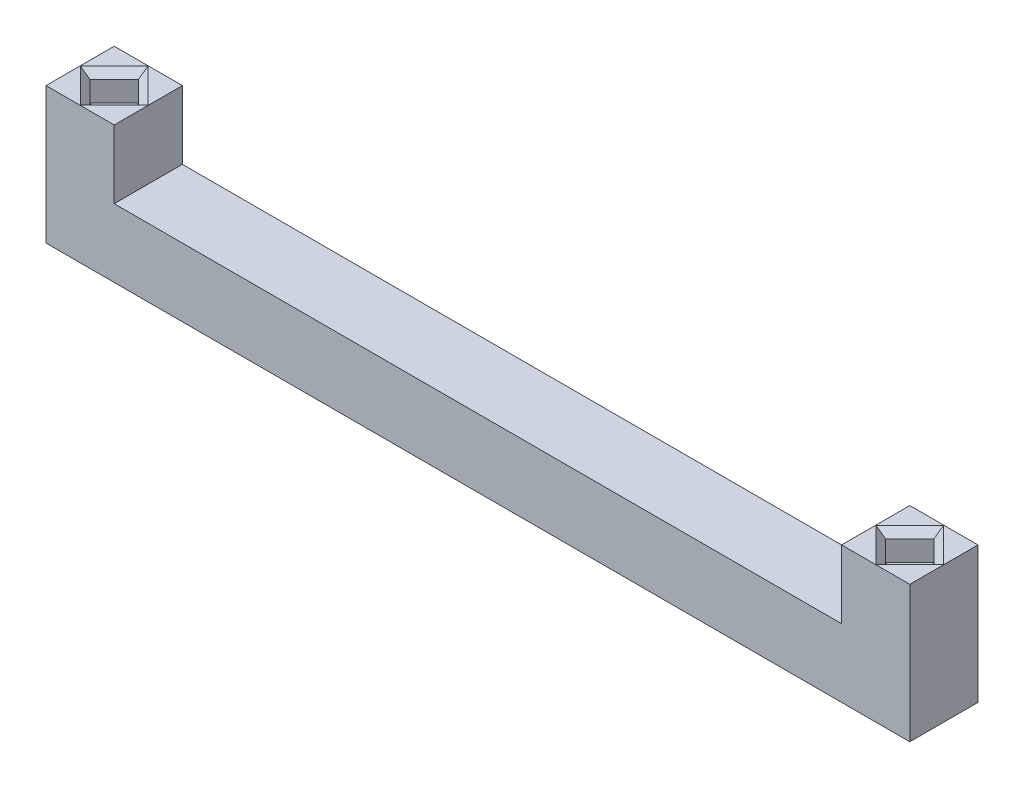
ISO-10303-21;
HEADER;
FILE_DESCRIPTION(('STEP AP214'),'2;1');
FILE_NAME('part.step','',(''),(''),'','','');
FILE_SCHEMA(('AUTOMOTIVE_DESIGN { 1 0 10303 214 1 1 1 1 }'));
ENDSEC;
DATA;
#1=APPLICATION_CONTEXT('core data for automotive mechanical design processes');
#2=APPLICATION_PROTOCOL_DEFINITION('international standard','automotive_design',2000,#1);
#3=PRODUCT_CONTEXT('',#1,'mechanical');
#4=PRODUCT('Part','Part','',(#3));
#5=PRODUCT_RELATED_PRODUCT_CATEGORY('part','',(#4));
#6=PRODUCT_DEFINITION_FORMATION('','',#4);
#7=PRODUCT_DEFINITION_CONTEXT('part definition',#1,'design');
#8=PRODUCT_DEFINITION('design','',#6,#7);
#9=PRODUCT_DEFINITION_SHAPE('','',#8);
#10=(LENGTH_UNIT() NAMED_UNIT(*) SI_UNIT(.MILLI.,.METRE.));
#11=(NAMED_UNIT(*) PLANE_ANGLE_UNIT() SI_UNIT($,.RADIAN.));
#12=(NAMED_UNIT(*) SI_UNIT($,.STERADIAN.) SOLID_ANGLE_UNIT());
#13=UNCERTAINTY_MEASURE_WITH_UNIT(LENGTH_MEASURE(1.E-05),#10,'distance_accuracy_value','');
#14=(GEOMETRIC_REPRESENTATION_CONTEXT(3) GLOBAL_UNCERTAINTY_ASSIGNED_CONTEXT((#13)) GLOBAL_UNIT_ASSIGNED_CONTEXT((#10,
#11,#12)) REPRESENTATION_CONTEXT('',''));
#15=CARTESIAN_POINT('',(0.,0.,0.));
#16=DIRECTION('',(0.,0.,1.));
#17=DIRECTION('',(1.,0.,0.));
#18=AXIS2_PLACEMENT_3D('',#15,#16,#17);
#19=CARTESIAN_POINT('',(-67.7333333333333,19.05,12.7));
#20=DIRECTION('',(0.,-1.,0.));
#21=DIRECTION('',(1.,0.,0.));
#22=AXIS2_PLACEMENT_3D('',#19,#20,#21);
#23=PLANE('',#22);
#24=DIRECTION('',(0.707106781186547,0.,0.707106781186548));
#25=VECTOR('',#24,1.);
#26=CARTESIAN_POINT('',(-64.5902436909591,19.05,9.55691035762579));
#27=LINE('',#26,#25);
#28=CARTESIAN_POINT('',(-74.0833333333333,19.05,0.0638207152515661));
#29=VERTEX_POINT('',#28);
#30=CARTESIAN_POINT('',(-67.7971540485849,19.05,6.35));
#31=VERTEX_POINT('',#30);
#32=EDGE_CURVE('E292',#29,#31,#27,.T.);
#33=ORIENTED_EDGE('',*,*,#32,.T.);
#34=DIRECTION('',(-0.707106781186547,0.,0.707106781186548));
#35=VECTOR('',#34,1.);
#36=CARTESIAN_POINT('',(-70.9402436909591,19.05,9.49308964237422));
#37=LINE('',#36,#35);
#38=CARTESIAN_POINT('',(-74.0833333333333,19.05,12.6361792847484));
#39=VERTEX_POINT('',#38);
#40=EDGE_CURVE('E294',#31,#39,#37,.T.);
#41=ORIENTED_EDGE('',*,*,#40,.T.);
#42=DIRECTION('',(-0.707106781186547,0.,-0.707106781186548));
#43=VECTOR('',#42,1.);
#44=CARTESIAN_POINT('',(-70.8764229757076,19.05,15.8430896423742));
#45=LINE('',#44,#43);
#46=CARTESIAN_POINT('',(-80.3695126180818,19.05,6.35));
#47=VERTEX_POINT('',#46);
#48=EDGE_CURVE('E290',#39,#47,#45,.T.);
#49=ORIENTED_EDGE('',*,*,#48,.T.);
#50=DIRECTION('',(0.707106781186547,0.,-0.707106781186548));
#51=VECTOR('',#50,1.);
#52=CARTESIAN_POINT('',(-77.2264229757075,19.05,3.20691035762578));
#53=LINE('',#52,#51);
#54=EDGE_CURVE('E288',#47,#29,#53,.T.);
#55=ORIENTED_EDGE('',*,*,#54,.T.);
#56=EDGE_LOOP('',(#33,#41,#49,#55));
#57=FACE_BOUND('',#56,.T.);
#58=DIRECTION('',(-1.,0.,0.));
#59=VECTOR('',#58,1.);
#60=CARTESIAN_POINT('',(-67.7333333333333,19.05,0.));
#61=LINE('',#60,#59);
#62=CARTESIAN_POINT('',(-67.7333333333333,19.05,0.));
#63=VERTEX_POINT('',#62);
#64=CARTESIAN_POINT('',(-80.4333333333333,19.05,0.));
#65=VERTEX_POINT('',#64);
#66=EDGE_CURVE('E228',#63,#65,#61,.T.);
#67=ORIENTED_EDGE('',*,*,#66,.T.);
#68=DIRECTION('',(0.,0.,-1.));
#69=VECTOR('',#68,1.);
#70=CARTESIAN_POINT('',(-80.4333333333333,19.05,12.7));
#71=LINE('',#70,#69);
#72=CARTESIAN_POINT('',(-80.4333333333333,19.05,12.7));
#73=VERTEX_POINT('',#72);
#74=EDGE_CURVE('E209',#73,#65,#71,.T.);
#75=ORIENTED_EDGE('',*,*,#74,.F.);
#76=DIRECTION('',(-1.,0.,0.));
#77=VECTOR('',#76,1.);
#78=CARTESIAN_POINT('',(-67.7333333333333,19.05,12.7));
#79=LINE('',#78,#77);
#80=CARTESIAN_POINT('',(-67.7333333333333,19.05,12.7));
#81=VERTEX_POINT('',#80);
#82=EDGE_CURVE('E216',#81,#73,#79,.T.);
#83=ORIENTED_EDGE('',*,*,#82,.F.);
#84=DIRECTION('',(0.,0.,-1.));
#85=VECTOR('',#84,1.);
#86=CARTESIAN_POINT('',(-67.7333333333333,19.05,12.7));
#87=LINE('',#86,#85);
#88=EDGE_CURVE('E382',#81,#63,#87,.T.);
#89=ORIENTED_EDGE('',*,*,#88,.T.);
#90=EDGE_LOOP('',(#67,#75,#83,#89));
#91=FACE_BOUND('',#90,.T.);
#92=ADVANCED_FACE('F41',(#57,#91),#23,.F.);
#93=CARTESIAN_POINT('',(-80.4333333333333,19.05,12.7));
#94=DIRECTION('',(1.,0.,0.));
#95=DIRECTION('',(0.,0.,-1.));
#96=AXIS2_PLACEMENT_3D('',#93,#94,#95);
#97=PLANE('',#96);
#98=DIRECTION('',(0.,-1.,0.));
#99=VECTOR('',#98,1.);
#100=CARTESIAN_POINT('',(-80.4333333333333,19.05,0.));
#101=LINE('',#100,#99);
#102=CARTESIAN_POINT('',(-80.4333333333333,-6.35,0.));
#103=VERTEX_POINT('',#102);
#104=EDGE_CURVE('E384',#65,#103,#101,.T.);
#105=ORIENTED_EDGE('',*,*,#104,.T.);
#106=DIRECTION('',(0.,0.,-1.));
#107=VECTOR('',#106,1.);
#108=CARTESIAN_POINT('',(-80.4333333333333,-6.35,12.7));
#109=LINE('',#108,#107);
#110=CARTESIAN_POINT('',(-80.4333333333333,-6.35,12.7));
#111=VERTEX_POINT('',#110);
#112=EDGE_CURVE('E212',#111,#103,#109,.T.);
#113=ORIENTED_EDGE('',*,*,#112,.F.);
#114=DIRECTION('',(0.,-1.,0.));
#115=VECTOR('',#114,1.);
#116=CARTESIAN_POINT('',(-80.4333333333333,19.05,12.7));
#117=LINE('',#116,#115);
#118=EDGE_CURVE('E205',#73,#111,#117,.T.);
#119=ORIENTED_EDGE('',*,*,#118,.F.);
#120=ORIENTED_EDGE('',*,*,#74,.T.);
#121=EDGE_LOOP('',(#105,#113,#119,#120));
#122=FACE_BOUND('',#121,.T.);
#123=ADVANCED_FACE('F207',(#122),#97,.F.);
#124=CARTESIAN_POINT('',(-80.4333333333333,-6.35,12.7));
#125=DIRECTION('',(0.,1.,0.));
#126=DIRECTION('',(0.,0.,1.));
#127=AXIS2_PLACEMENT_3D('',#124,#125,#126);
#128=PLANE('',#127);
#129=DIRECTION('',(1.,0.,0.));
#130=VECTOR('',#129,1.);
#131=CARTESIAN_POINT('',(-80.4333333333333,-6.35,0.));
#132=LINE('',#131,#130);
#133=CARTESIAN_POINT('',(80.4333333333333,-6.35,0.));
#134=VERTEX_POINT('',#133);
#135=EDGE_CURVE('E387',#103,#134,#132,.T.);
#136=ORIENTED_EDGE('',*,*,#135,.T.);
#137=DIRECTION('',(0.,0.,-1.));
#138=VECTOR('',#137,1.);
#139=CARTESIAN_POINT('',(80.4333333333333,-6.35,12.7));
#140=LINE('',#139,#138);
#141=CARTESIAN_POINT('',(80.4333333333333,-6.35,12.7));
#142=VERTEX_POINT('',#141);
#143=EDGE_CURVE('E233',#142,#134,#140,.T.);
#144=ORIENTED_EDGE('',*,*,#143,.F.);
#145=DIRECTION('',(1.,0.,0.));
#146=VECTOR('',#145,1.);
#147=CARTESIAN_POINT('',(-80.4333333333333,-6.35,12.7));
#148=LINE('',#147,#146);
#149=EDGE_CURVE('E215',#111,#142,#148,.T.);
#150=ORIENTED_EDGE('',*,*,#149,.F.);
#151=ORIENTED_EDGE('',*,*,#112,.T.);
#152=EDGE_LOOP('',(#136,#144,#150,#151));
#153=FACE_BOUND('',#152,.T.);
#154=ADVANCED_FACE('F432',(#153),#128,.F.);
#155=CARTESIAN_POINT('',(80.4333333333333,-6.35,12.7));
#156=DIRECTION('',(-1.,0.,0.));
#157=DIRECTION('',(0.,0.,1.));
#158=AXIS2_PLACEMENT_3D('',#155,#156,#157);
#159=PLANE('',#158);
#160=DIRECTION('',(0.,1.,0.));
#161=VECTOR('',#160,1.);
#162=CARTESIAN_POINT('',(80.4333333333333,-6.35,0.));
#163=LINE('',#162,#161);
#164=CARTESIAN_POINT('',(80.4333333333333,19.05,0.));
#165=VERTEX_POINT('',#164);
#166=EDGE_CURVE('E389',#134,#165,#163,.T.);
#167=ORIENTED_EDGE('',*,*,#166,.T.);
#168=DIRECTION('',(0.,0.,-1.));
#169=VECTOR('',#168,1.);
#170=CARTESIAN_POINT('',(80.4333333333333,19.05,12.7));
#171=LINE('',#170,#169);
#172=CARTESIAN_POINT('',(80.4333333333333,19.05,12.7));
#173=VERTEX_POINT('',#172);
#174=EDGE_CURVE('E408',#173,#165,#171,.T.);
#175=ORIENTED_EDGE('',*,*,#174,.F.);
#176=DIRECTION('',(0.,1.,0.));
#177=VECTOR('',#176,1.);
#178=CARTESIAN_POINT('',(80.4333333333333,-6.35,12.7));
#179=LINE('',#178,#177);
#180=EDGE_CURVE('E373',#142,#173,#179,.T.);
#181=ORIENTED_EDGE('',*,*,#180,.F.);
#182=ORIENTED_EDGE('',*,*,#143,.T.);
#183=EDGE_LOOP('',(#167,#175,#181,#182));
#184=FACE_BOUND('',#183,.T.);
#185=ADVANCED_FACE('F415',(#184),#159,.F.);
#186=CARTESIAN_POINT('',(80.4333333333333,19.05,12.7));
#187=DIRECTION('',(0.,-1.,0.));
#188=DIRECTION('',(1.,0.,0.));
#189=AXIS2_PLACEMENT_3D('',#186,#187,#188);
#190=PLANE('',#189);
#191=DIRECTION('',(0.707106781186547,0.,-0.707106781186548));
#192=VECTOR('',#191,1.);
#193=CARTESIAN_POINT('',(70.9402436909591,19.05,3.20691035762581));
#194=LINE('',#193,#192);
#195=CARTESIAN_POINT('',(67.797154048585,19.05,6.35));
#196=VERTEX_POINT('',#195);
#197=CARTESIAN_POINT('',(74.0833333333333,19.05,0.0638207152516151));
#198=VERTEX_POINT('',#197);
#199=EDGE_CURVE('E297',#196,#198,#194,.T.);
#200=ORIENTED_EDGE('',*,*,#199,.T.);
#201=DIRECTION('',(0.707106781186547,0.,0.707106781186548));
#202=VECTOR('',#201,1.);
#203=CARTESIAN_POINT('',(83.5764229757075,19.05,9.55691035762581));
#204=LINE('',#203,#202);
#205=CARTESIAN_POINT('',(80.3695126180817,19.05,6.35));
#206=VERTEX_POINT('',#205);
#207=EDGE_CURVE('E11',#198,#206,#204,.T.);
#208=ORIENTED_EDGE('',*,*,#207,.T.);
#209=DIRECTION('',(-0.707106781186547,0.,0.707106781186548));
#210=VECTOR('',#209,1.);
#211=CARTESIAN_POINT('',(77.2264229757075,19.05,9.49308964237419));
#212=LINE('',#211,#210);
#213=CARTESIAN_POINT('',(74.0833333333333,19.05,12.6361792847484));
#214=VERTEX_POINT('',#213);
#215=EDGE_CURVE('E51',#206,#214,#212,.T.);
#216=ORIENTED_EDGE('',*,*,#215,.T.);
#217=DIRECTION('',(-0.707106781186547,0.,-0.707106781186548));
#218=VECTOR('',#217,1.);
#219=CARTESIAN_POINT('',(77.2902436909591,19.05,15.8430896423742));
#220=LINE('',#219,#218);
#221=EDGE_CURVE('E299',#214,#196,#220,.T.);
#222=ORIENTED_EDGE('',*,*,#221,.T.);
#223=EDGE_LOOP('',(#200,#208,#216,#222));
#224=FACE_BOUND('',#223,.T.);
#225=DIRECTION('',(-1.,0.,0.));
#226=VECTOR('',#225,1.);
#227=CARTESIAN_POINT('',(80.4333333333333,19.05,0.));
#228=LINE('',#227,#226);
#229=CARTESIAN_POINT('',(67.7333333333333,19.05,0.));
#230=VERTEX_POINT('',#229);
#231=EDGE_CURVE('E391',#165,#230,#228,.T.);
#232=ORIENTED_EDGE('',*,*,#231,.T.);
#233=DIRECTION('',(0.,0.,-1.));
#234=VECTOR('',#233,1.);
#235=CARTESIAN_POINT('',(67.7333333333333,19.05,12.7));
#236=LINE('',#235,#234);
#237=CARTESIAN_POINT('',(67.7333333333333,19.05,12.7));
#238=VERTEX_POINT('',#237);
#239=EDGE_CURVE('E405',#238,#230,#236,.T.);
#240=ORIENTED_EDGE('',*,*,#239,.F.);
#241=DIRECTION('',(-1.,0.,0.));
#242=VECTOR('',#241,1.);
#243=CARTESIAN_POINT('',(80.4333333333333,19.05,12.7));
#244=LINE('',#243,#242);
#245=EDGE_CURVE('E375',#173,#238,#244,.T.);
#246=ORIENTED_EDGE('',*,*,#245,.F.);
#247=ORIENTED_EDGE('',*,*,#174,.T.);
#248=EDGE_LOOP('',(#232,#240,#246,#247));
#249=FACE_BOUND('',#248,.T.);
#250=ADVANCED_FACE('F348',(#224,#249),#190,.F.);
#251=CARTESIAN_POINT('',(67.7333333333333,19.05,12.7));
#252=DIRECTION('',(1.,0.,0.));
#253=DIRECTION('',(0.,0.,-1.));
#254=AXIS2_PLACEMENT_3D('',#251,#252,#253);
#255=PLANE('',#254);
#256=DIRECTION('',(0.,-1.,0.));
#257=VECTOR('',#256,1.);
#258=CARTESIAN_POINT('',(67.7333333333333,19.05,0.));
#259=LINE('',#258,#257);
#260=CARTESIAN_POINT('',(67.7333333333333,6.35,0.));
#261=VERTEX_POINT('',#260);
#262=EDGE_CURVE('E393',#230,#261,#259,.T.);
#263=ORIENTED_EDGE('',*,*,#262,.T.);
#264=DIRECTION('',(0.,0.,-1.));
#265=VECTOR('',#264,1.);
#266=CARTESIAN_POINT('',(67.7333333333333,6.35,12.7));
#267=LINE('',#266,#265);
#268=CARTESIAN_POINT('',(67.7333333333333,6.35,12.7));
#269=VERTEX_POINT('',#268);
#270=EDGE_CURVE('E402',#269,#261,#267,.T.);
#271=ORIENTED_EDGE('',*,*,#270,.F.);
#272=DIRECTION('',(0.,-1.,0.));
#273=VECTOR('',#272,1.);
#274=CARTESIAN_POINT('',(67.7333333333333,19.05,12.7));
#275=LINE('',#274,#273);
#276=EDGE_CURVE('E377',#238,#269,#275,.T.);
#277=ORIENTED_EDGE('',*,*,#276,.F.);
#278=ORIENTED_EDGE('',*,*,#239,.T.);
#279=EDGE_LOOP('',(#263,#271,#277,#278));
#280=FACE_BOUND('',#279,.T.);
#281=ADVANCED_FACE('F428',(#280),#255,.F.);
#282=CARTESIAN_POINT('',(67.7333333333333,6.35,12.7));
#283=DIRECTION('',(0.,-1.,0.));
#284=DIRECTION('',(0.,0.,-1.));
#285=AXIS2_PLACEMENT_3D('',#282,#283,#284);
#286=PLANE('',#285);
#287=DIRECTION('',(-1.,0.,0.));
#288=VECTOR('',#287,1.);
#289=CARTESIAN_POINT('',(67.7333333333333,6.35,0.));
#290=LINE('',#289,#288);
#291=CARTESIAN_POINT('',(-67.7333333333333,6.35,0.));
#292=VERTEX_POINT('',#291);
#293=EDGE_CURVE('E395',#261,#292,#290,.T.);
#294=ORIENTED_EDGE('',*,*,#293,.T.);
#295=DIRECTION('',(0.,0.,-1.));
#296=VECTOR('',#295,1.);
#297=CARTESIAN_POINT('',(-67.7333333333333,6.35,12.7));
#298=LINE('',#297,#296);
#299=CARTESIAN_POINT('',(-67.7333333333333,6.35,12.7));
#300=VERTEX_POINT('',#299);
#301=EDGE_CURVE('E399',#300,#292,#298,.T.);
#302=ORIENTED_EDGE('',*,*,#301,.F.);
#303=DIRECTION('',(-1.,0.,0.));
#304=VECTOR('',#303,1.);
#305=CARTESIAN_POINT('',(67.7333333333333,6.35,12.7));
#306=LINE('',#305,#304);
#307=EDGE_CURVE('E379',#269,#300,#306,.T.);
#308=ORIENTED_EDGE('',*,*,#307,.F.);
#309=ORIENTED_EDGE('',*,*,#270,.T.);
#310=EDGE_LOOP('',(#294,#302,#308,#309));
#311=FACE_BOUND('',#310,.T.);
#312=ADVANCED_FACE('F718',(#311),#286,.F.);
#313=CARTESIAN_POINT('',(-67.7333333333333,6.35,12.7));
#314=DIRECTION('',(-1.,0.,0.));
#315=DIRECTION('',(0.,0.,1.));
#316=AXIS2_PLACEMENT_3D('',#313,#314,#315);
#317=PLANE('',#316);
#318=DIRECTION('',(0.,1.,0.));
#319=VECTOR('',#318,1.);
#320=CARTESIAN_POINT('',(-67.7333333333333,6.35,0.));
#321=LINE('',#320,#319);
#322=EDGE_CURVE('E225',#292,#63,#321,.T.);
#323=ORIENTED_EDGE('',*,*,#322,.T.);
#324=ORIENTED_EDGE('',*,*,#88,.F.);
#325=DIRECTION('',(0.,1.,0.));
#326=VECTOR('',#325,1.);
#327=CARTESIAN_POINT('',(-67.7333333333333,6.35,12.7));
#328=LINE('',#327,#326);
#329=EDGE_CURVE('E221',#300,#81,#328,.T.);
#330=ORIENTED_EDGE('',*,*,#329,.F.);
#331=ORIENTED_EDGE('',*,*,#301,.T.);
#332=EDGE_LOOP('',(#323,#324,#330,#331));
#333=FACE_BOUND('',#332,.T.);
#334=ADVANCED_FACE('F727',(#333),#317,.F.);
#335=CARTESIAN_POINT('',(0.,0.,12.7));
#336=DIRECTION('',(0.,0.,1.));
#337=DIRECTION('',(1.,0.,0.));
#338=AXIS2_PLACEMENT_3D('',#335,#336,#337);
#339=PLANE('',#338);
#340=ORIENTED_EDGE('',*,*,#82,.T.);
#341=ORIENTED_EDGE('',*,*,#118,.T.);
#342=ORIENTED_EDGE('',*,*,#149,.T.);
#343=ORIENTED_EDGE('',*,*,#180,.T.);
#344=ORIENTED_EDGE('',*,*,#245,.T.);
#345=ORIENTED_EDGE('',*,*,#276,.T.);
#346=ORIENTED_EDGE('',*,*,#307,.T.);
#347=ORIENTED_EDGE('',*,*,#329,.T.);
#348=EDGE_LOOP('',(#340,#341,#342,#343,#344,#345,#346,#347));
#349=FACE_BOUND('',#348,.T.);
#350=ADVANCED_FACE('F219',(#349),#339,.T.);
#351=CARTESIAN_POINT('',(0.,0.,0.));
#352=DIRECTION('',(0.,0.,1.));
#353=DIRECTION('',(1.,0.,0.));
#354=AXIS2_PLACEMENT_3D('',#351,#352,#353);
#355=PLANE('',#354);
#356=ORIENTED_EDGE('',*,*,#66,.F.);
#357=ORIENTED_EDGE('',*,*,#322,.F.);
#358=ORIENTED_EDGE('',*,*,#293,.F.);
#359=ORIENTED_EDGE('',*,*,#262,.F.);
#360=ORIENTED_EDGE('',*,*,#231,.F.);
#361=ORIENTED_EDGE('',*,*,#166,.F.);
#362=ORIENTED_EDGE('',*,*,#135,.F.);
#363=ORIENTED_EDGE('',*,*,#104,.F.);
#364=EDGE_LOOP('',(#356,#357,#358,#359,#360,#361,#362,#363));
#365=FACE_BOUND('',#364,.T.);
#366=ADVANCED_FACE('F421',(#365),#355,.F.);
#367=CARTESIAN_POINT('',(69.5932052727988,12.7,6.35));
#368=DIRECTION('',(-0.707106781186548,0.,0.707106781186547));
#369=DIRECTION('',(0.707106781186547,0.,0.707106781186548));
#370=AXIS2_PLACEMENT_3D('',#367,#368,#369);
#371=PLANE('',#370);
#372=DIRECTION('',(0.,1.,0.));
#373=VECTOR('',#372,1.);
#374=CARTESIAN_POINT('',(74.0833333333333,12.7,10.8401280605346));
#375=LINE('',#374,#373);
#376=CARTESIAN_POINT('',(74.0833333333333,13.9699999999999,10.8401280605346));
#377=VERTEX_POINT('',#376);
#378=CARTESIAN_POINT('',(74.0833333333333,17.78,10.8401280605346));
#379=VERTEX_POINT('',#378);
#380=EDGE_CURVE('E367',#377,#379,#375,.T.);
#381=ORIENTED_EDGE('',*,*,#380,.F.);
#382=DIRECTION('',(-0.707106781186547,0.,-0.707106781186548));
#383=VECTOR('',#382,1.);
#384=CARTESIAN_POINT('',(69.5932052727988,13.9699999999999,6.35));
#385=LINE('',#384,#383);
#386=CARTESIAN_POINT('',(69.5932052727988,13.9699999999999,6.35));
#387=VERTEX_POINT('',#386);
#388=EDGE_CURVE('E259',#377,#387,#385,.T.);
#389=ORIENTED_EDGE('',*,*,#388,.T.);
#390=DIRECTION('',(0.,1.,0.));
#391=VECTOR('',#390,1.);
#392=CARTESIAN_POINT('',(69.5932052727988,12.7,6.35));
#393=LINE('',#392,#391);
#394=CARTESIAN_POINT('',(69.5932052727988,17.78,6.35));
#395=VERTEX_POINT('',#394);
#396=EDGE_CURVE('E313',#387,#395,#393,.T.);
#397=ORIENTED_EDGE('',*,*,#396,.T.);
#398=DIRECTION('',(0.707106781186547,0.,0.707106781186548));
#399=VECTOR('',#398,1.);
#400=CARTESIAN_POINT('',(69.5932052727988,17.78,6.35));
#401=LINE('',#400,#399);
#402=EDGE_CURVE('E257',#395,#379,#401,.T.);
#403=ORIENTED_EDGE('',*,*,#402,.T.);
#404=EDGE_LOOP('',(#381,#389,#397,#403));
#405=FACE_BOUND('',#404,.T.);
#406=ADVANCED_FACE('F688',(#405),#371,.F.);
#407=CARTESIAN_POINT('',(69.5932052727988,12.7,6.35));
#408=DIRECTION('',(-0.707106781186548,0.,-0.707106781186547));
#409=DIRECTION('',(-0.707106781186547,0.,0.707106781186548));
#410=AXIS2_PLACEMENT_3D('',#407,#408,#409);
#411=PLANE('',#410);
#412=ORIENTED_EDGE('',*,*,#396,.F.);
#413=DIRECTION('',(0.707106781186547,0.,-0.707106781186548));
#414=VECTOR('',#413,1.);
#415=CARTESIAN_POINT('',(69.5932052727988,13.97,6.35));
#416=LINE('',#415,#414);
#417=CARTESIAN_POINT('',(74.0833333333333,13.9699999999999,1.85987193946542));
#418=VERTEX_POINT('',#417);
#419=EDGE_CURVE('E245',#387,#418,#416,.T.);
#420=ORIENTED_EDGE('',*,*,#419,.T.);
#421=DIRECTION('',(0.,1.,0.));
#422=VECTOR('',#421,1.);
#423=CARTESIAN_POINT('',(74.0833333333333,12.7,1.85987193946542));
#424=LINE('',#423,#422);
#425=CARTESIAN_POINT('',(74.0833333333333,17.78,1.85987193946542));
#426=VERTEX_POINT('',#425);
#427=EDGE_CURVE('E361',#418,#426,#424,.T.);
#428=ORIENTED_EDGE('',*,*,#427,.T.);
#429=DIRECTION('',(-0.707106781186547,0.,0.707106781186548));
#430=VECTOR('',#429,1.);
#431=CARTESIAN_POINT('',(69.5932052727988,17.78,6.35));
#432=LINE('',#431,#430);
#433=EDGE_CURVE('E243',#426,#395,#432,.T.);
#434=ORIENTED_EDGE('',*,*,#433,.T.);
#435=EDGE_LOOP('',(#412,#420,#428,#434));
#436=FACE_BOUND('',#435,.T.);
#437=ADVANCED_FACE('F364',(#436),#411,.F.);
#438=CARTESIAN_POINT('',(74.0833333333333,12.7,1.85987193946542));
#439=DIRECTION('',(0.707106781186548,0.,-0.707106781186547));
#440=DIRECTION('',(-0.707106781186547,0.,-0.707106781186548));
#441=AXIS2_PLACEMENT_3D('',#438,#439,#440);
#442=PLANE('',#441);
#443=ORIENTED_EDGE('',*,*,#427,.F.);
#444=DIRECTION('',(0.707106781186547,0.,0.707106781186548));
#445=VECTOR('',#444,1.);
#446=CARTESIAN_POINT('',(74.0833333333333,13.9699999999999,1.85987193946542));
#447=LINE('',#446,#445);
#448=CARTESIAN_POINT('',(78.5734613938679,13.9699999999999,6.35));
#449=VERTEX_POINT('',#448);
#450=EDGE_CURVE('E251',#418,#449,#447,.T.);
#451=ORIENTED_EDGE('',*,*,#450,.T.);
#452=DIRECTION('',(0.,1.,0.));
#453=VECTOR('',#452,1.);
#454=CARTESIAN_POINT('',(78.5734613938679,12.7,6.35));
#455=LINE('',#454,#453);
#456=CARTESIAN_POINT('',(78.5734613938679,17.78,6.35));
#457=VERTEX_POINT('',#456);
#458=EDGE_CURVE('E363',#449,#457,#455,.T.);
#459=ORIENTED_EDGE('',*,*,#458,.T.);
#460=DIRECTION('',(-0.707106781186547,0.,-0.707106781186548));
#461=VECTOR('',#460,1.);
#462=CARTESIAN_POINT('',(74.0833333333333,17.78,1.85987193946542));
#463=LINE('',#462,#461);
#464=EDGE_CURVE('E248',#457,#426,#463,.T.);
#465=ORIENTED_EDGE('',*,*,#464,.T.);
#466=EDGE_LOOP('',(#443,#451,#459,#465));
#467=FACE_BOUND('',#466,.T.);
#468=ADVANCED_FACE('F360',(#467),#442,.F.);
#469=CARTESIAN_POINT('',(74.0833333333333,12.7,10.8401280605346));
#470=DIRECTION('',(0.707106781186548,0.,0.707106781186547));
#471=DIRECTION('',(0.707106781186547,0.,-0.707106781186548));
#472=AXIS2_PLACEMENT_3D('',#469,#470,#471);
#473=PLANE('',#472);
#474=ORIENTED_EDGE('',*,*,#458,.F.);
#475=DIRECTION('',(-0.707106781186547,0.,0.707106781186548));
#476=VECTOR('',#475,1.);
#477=CARTESIAN_POINT('',(74.0833333333333,13.9699999999999,10.8401280605346));
#478=LINE('',#477,#476);
#479=EDGE_CURVE('E255',#449,#377,#478,.T.);
#480=ORIENTED_EDGE('',*,*,#479,.T.);
#481=ORIENTED_EDGE('',*,*,#380,.T.);
#482=DIRECTION('',(0.707106781186547,0.,-0.707106781186548));
#483=VECTOR('',#482,1.);
#484=CARTESIAN_POINT('',(74.0833333333333,17.78,10.8401280605346));
#485=LINE('',#484,#483);
#486=EDGE_CURVE('E253',#379,#457,#485,.T.);
#487=ORIENTED_EDGE('',*,*,#486,.T.);
#488=EDGE_LOOP('',(#474,#480,#481,#487));
#489=FACE_BOUND('',#488,.T.);
#490=ADVANCED_FACE('F664',(#489),#473,.F.);
#491=CARTESIAN_POINT('',(0.,12.7,0.));
#492=DIRECTION('',(0.,1.,0.));
#493=DIRECTION('',(0.,0.,1.));
#494=AXIS2_PLACEMENT_3D('',#491,#492,#493);
#495=PLANE('',#494);
#496=DIRECTION('',(-0.707106781186547,0.,-0.707106781186548));
#497=VECTOR('',#496,1.);
#498=CARTESIAN_POINT('',(35.2137050848271,12.7,-35.2137050848271));
#499=LINE('',#498,#497);
#500=CARTESIAN_POINT('',(76.7774101696541,12.7,6.35));
#501=VERTEX_POINT('',#500);
#502=CARTESIAN_POINT('',(74.0833333333333,12.7,3.65592316367923));
#503=VERTEX_POINT('',#502);
#504=EDGE_CURVE('E238',#501,#503,#499,.T.);
#505=ORIENTED_EDGE('',*,*,#504,.T.);
#506=DIRECTION('',(-0.707106781186547,0.,0.707106781186548));
#507=VECTOR('',#506,1.);
#508=CARTESIAN_POINT('',(38.8696282485063,12.7,38.8696282485063));
#509=LINE('',#508,#507);
#510=CARTESIAN_POINT('',(71.3892564970126,12.7,6.35));
#511=VERTEX_POINT('',#510);
#512=EDGE_CURVE('E240',#503,#511,#509,.T.);
#513=ORIENTED_EDGE('',*,*,#512,.T.);
#514=DIRECTION('',(0.707106781186547,0.,0.707106781186548));
#515=VECTOR('',#514,1.);
#516=CARTESIAN_POINT('',(32.5196282485063,12.7,-32.5196282485063));
#517=LINE('',#516,#515);
#518=CARTESIAN_POINT('',(74.0833333333333,12.7,9.04407683632077));
#519=VERTEX_POINT('',#518);
#520=EDGE_CURVE('E229',#511,#519,#517,.T.);
#521=ORIENTED_EDGE('',*,*,#520,.T.);
#522=DIRECTION('',(0.707106781186547,0.,-0.707106781186548));
#523=VECTOR('',#522,1.);
#524=CARTESIAN_POINT('',(41.5637050848271,12.7,41.5637050848271));
#525=LINE('',#524,#523);
#526=EDGE_CURVE('E231',#519,#501,#525,.T.);
#527=ORIENTED_EDGE('',*,*,#526,.T.);
#528=EDGE_LOOP('',(#505,#513,#521,#527));
#529=FACE_BOUND('',#528,.T.);
#530=ADVANCED_FACE('F655',(#529),#495,.T.);
#531=CARTESIAN_POINT('',(-78.5734613938679,12.7,6.35));
#532=DIRECTION('',(-0.707106781186548,0.,0.707106781186547));
#533=DIRECTION('',(0.707106781186547,0.,0.707106781186548));
#534=AXIS2_PLACEMENT_3D('',#531,#532,#533);
#535=PLANE('',#534);
#536=DIRECTION('',(0.,1.,0.));
#537=VECTOR('',#536,1.);
#538=CARTESIAN_POINT('',(-74.0833333333333,12.7,10.8401280605346));
#539=LINE('',#538,#537);
#540=CARTESIAN_POINT('',(-74.0833333333333,13.97,10.8401280605346));
#541=VERTEX_POINT('',#540);
#542=CARTESIAN_POINT('',(-74.0833333333333,17.78,10.8401280605346));
#543=VERTEX_POINT('',#542);
#544=EDGE_CURVE('E814',#541,#543,#539,.T.);
#545=ORIENTED_EDGE('',*,*,#544,.F.);
#546=DIRECTION('',(-0.707106781186547,0.,-0.707106781186548));
#547=VECTOR('',#546,1.);
#548=CARTESIAN_POINT('',(-78.5734613938679,13.97,6.35));
#549=LINE('',#548,#547);
#550=CARTESIAN_POINT('',(-78.5734613938679,13.97,6.35));
#551=VERTEX_POINT('',#550);
#552=EDGE_CURVE('E286',#541,#551,#549,.T.);
#553=ORIENTED_EDGE('',*,*,#552,.T.);
#554=DIRECTION('',(0.,1.,0.));
#555=VECTOR('',#554,1.);
#556=CARTESIAN_POINT('',(-78.5734613938679,12.7,6.35));
#557=LINE('',#556,#555);
#558=CARTESIAN_POINT('',(-78.5734613938679,17.78,6.35));
#559=VERTEX_POINT('',#558);
#560=EDGE_CURVE('E385',#551,#559,#557,.T.);
#561=ORIENTED_EDGE('',*,*,#560,.T.);
#562=DIRECTION('',(0.707106781186547,0.,0.707106781186548));
#563=VECTOR('',#562,1.);
#564=CARTESIAN_POINT('',(-78.5734613938679,17.78,6.35));
#565=LINE('',#564,#563);
#566=EDGE_CURVE('E284',#559,#543,#565,.T.);
#567=ORIENTED_EDGE('',*,*,#566,.T.);
#568=EDGE_LOOP('',(#545,#553,#561,#567));
#569=FACE_BOUND('',#568,.T.);
#570=ADVANCED_FACE('F646',(#569),#535,.F.);
#571=CARTESIAN_POINT('',(-78.5734613938679,12.7,6.35));
#572=DIRECTION('',(-0.707106781186548,0.,-0.707106781186547));
#573=DIRECTION('',(-0.707106781186547,0.,0.707106781186548));
#574=AXIS2_PLACEMENT_3D('',#571,#572,#573);
#575=PLANE('',#574);
#576=ORIENTED_EDGE('',*,*,#560,.F.);
#577=DIRECTION('',(0.707106781186547,0.,-0.707106781186548));
#578=VECTOR('',#577,1.);
#579=CARTESIAN_POINT('',(-78.5734613938679,13.97,6.35));
#580=LINE('',#579,#578);
#581=CARTESIAN_POINT('',(-74.0833333333333,13.97,1.85987193946542));
#582=VERTEX_POINT('',#581);
#583=EDGE_CURVE('E272',#551,#582,#580,.T.);
#584=ORIENTED_EDGE('',*,*,#583,.T.);
#585=DIRECTION('',(0.,1.,0.));
#586=VECTOR('',#585,1.);
#587=CARTESIAN_POINT('',(-74.0833333333333,12.7,1.85987193946542));
#588=LINE('',#587,#586);
#589=CARTESIAN_POINT('',(-74.0833333333333,17.78,1.85987193946542));
#590=VERTEX_POINT('',#589);
#591=EDGE_CURVE('E830',#582,#590,#588,.T.);
#592=ORIENTED_EDGE('',*,*,#591,.T.);
#593=DIRECTION('',(-0.707106781186547,0.,0.707106781186548));
#594=VECTOR('',#593,1.);
#595=CARTESIAN_POINT('',(-78.5734613938679,17.78,6.35));
#596=LINE('',#595,#594);
#597=EDGE_CURVE('E270',#590,#559,#596,.T.);
#598=ORIENTED_EDGE('',*,*,#597,.T.);
#599=EDGE_LOOP('',(#576,#584,#592,#598));
#600=FACE_BOUND('',#599,.T.);
#601=ADVANCED_FACE('F637',(#600),#575,.F.);
#602=CARTESIAN_POINT('',(-74.0833333333333,12.7,1.85987193946542));
#603=DIRECTION('',(0.707106781186548,0.,-0.707106781186547));
#604=DIRECTION('',(-0.707106781186547,0.,-0.707106781186548));
#605=AXIS2_PLACEMENT_3D('',#602,#603,#604);
#606=PLANE('',#605);
#607=ORIENTED_EDGE('',*,*,#591,.F.);
#608=DIRECTION('',(0.707106781186547,0.,0.707106781186548));
#609=VECTOR('',#608,1.);
#610=CARTESIAN_POINT('',(-74.0833333333333,13.97,1.85987193946542));
#611=LINE('',#610,#609);
#612=CARTESIAN_POINT('',(-69.5932052727988,13.97,6.35));
#613=VERTEX_POINT('',#612);
#614=EDGE_CURVE('E277',#582,#613,#611,.T.);
#615=ORIENTED_EDGE('',*,*,#614,.T.);
#616=DIRECTION('',(0.,1.,0.));
#617=VECTOR('',#616,1.);
#618=CARTESIAN_POINT('',(-69.5932052727988,12.7,6.35));
#619=LINE('',#618,#617);
#620=CARTESIAN_POINT('',(-69.5932052727988,17.78,6.35));
#621=VERTEX_POINT('',#620);
#622=EDGE_CURVE('E825',#613,#621,#619,.T.);
#623=ORIENTED_EDGE('',*,*,#622,.T.);
#624=DIRECTION('',(-0.707106781186547,0.,-0.707106781186548));
#625=VECTOR('',#624,1.);
#626=CARTESIAN_POINT('',(-74.0833333333333,17.78,1.85987193946542));
#627=LINE('',#626,#625);
#628=EDGE_CURVE('E275',#621,#590,#627,.T.);
#629=ORIENTED_EDGE('',*,*,#628,.T.);
#630=EDGE_LOOP('',(#607,#615,#623,#629));
#631=FACE_BOUND('',#630,.T.);
#632=ADVANCED_FACE('F628',(#631),#606,.F.);
#633=CARTESIAN_POINT('',(-74.0833333333333,12.7,10.8401280605346));
#634=DIRECTION('',(0.707106781186548,0.,0.707106781186547));
#635=DIRECTION('',(0.707106781186547,0.,-0.707106781186548));
#636=AXIS2_PLACEMENT_3D('',#633,#634,#635);
#637=PLANE('',#636);
#638=ORIENTED_EDGE('',*,*,#622,.F.);
#639=DIRECTION('',(-0.707106781186547,0.,0.707106781186548));
#640=VECTOR('',#639,1.);
#641=CARTESIAN_POINT('',(-74.0833333333333,13.97,10.8401280605346));
#642=LINE('',#641,#640);
#643=EDGE_CURVE('E282',#613,#541,#642,.T.);
#644=ORIENTED_EDGE('',*,*,#643,.T.);
#645=ORIENTED_EDGE('',*,*,#544,.T.);
#646=DIRECTION('',(0.707106781186547,0.,-0.707106781186548));
#647=VECTOR('',#646,1.);
#648=CARTESIAN_POINT('',(-74.0833333333333,17.78,10.8401280605346));
#649=LINE('',#648,#647);
#650=EDGE_CURVE('E279',#543,#621,#649,.T.);
#651=ORIENTED_EDGE('',*,*,#650,.T.);
#652=EDGE_LOOP('',(#638,#644,#645,#651));
#653=FACE_BOUND('',#652,.T.);
#654=ADVANCED_FACE('F619',(#653),#637,.F.);
#655=CARTESIAN_POINT('',(0.,12.7,0.));
#656=DIRECTION('',(0.,1.,0.));
#657=DIRECTION('',(0.,0.,1.));
#658=AXIS2_PLACEMENT_3D('',#655,#656,#657);
#659=PLANE('',#658);
#660=DIRECTION('',(-0.707106781186547,0.,-0.707106781186548));
#661=VECTOR('',#660,1.);
#662=CARTESIAN_POINT('',(-38.8696282485063,12.7,38.8696282485063));
#663=LINE('',#662,#661);
#664=CARTESIAN_POINT('',(-71.3892564970126,12.7,6.35000000000001));
#665=VERTEX_POINT('',#664);
#666=CARTESIAN_POINT('',(-74.0833333333333,12.7,3.65592316367928));
#667=VERTEX_POINT('',#666);
#668=EDGE_CURVE('E265',#665,#667,#663,.T.);
#669=ORIENTED_EDGE('',*,*,#668,.T.);
#670=DIRECTION('',(-0.707106781186547,0.,0.707106781186548));
#671=VECTOR('',#670,1.);
#672=CARTESIAN_POINT('',(-35.2137050848271,12.7,-35.213705084827));
#673=LINE('',#672,#671);
#674=CARTESIAN_POINT('',(-76.777410169654,12.7,6.35));
#675=VERTEX_POINT('',#674);
#676=EDGE_CURVE('E267',#667,#675,#673,.T.);
#677=ORIENTED_EDGE('',*,*,#676,.T.);
#678=DIRECTION('',(0.707106781186547,0.,0.707106781186548));
#679=VECTOR('',#678,1.);
#680=CARTESIAN_POINT('',(-41.5637050848271,12.7,41.563705084827));
#681=LINE('',#680,#679);
#682=CARTESIAN_POINT('',(-74.0833333333333,12.7,9.04407683632073));
#683=VERTEX_POINT('',#682);
#684=EDGE_CURVE('E261',#675,#683,#681,.T.);
#685=ORIENTED_EDGE('',*,*,#684,.T.);
#686=DIRECTION('',(0.707106781186547,0.,-0.707106781186548));
#687=VECTOR('',#686,1.);
#688=CARTESIAN_POINT('',(-32.5196282485064,12.7,-32.5196282485063));
#689=LINE('',#688,#687);
#690=EDGE_CURVE('E263',#683,#665,#689,.T.);
#691=ORIENTED_EDGE('',*,*,#690,.T.);
#692=EDGE_LOOP('',(#669,#677,#685,#691));
#693=FACE_BOUND('',#692,.T.);
#694=ADVANCED_FACE('F478',(#693),#659,.T.);
#695=CARTESIAN_POINT('',(41.5637050848271,12.7,41.563705084827));
#696=DIRECTION('',(0.5,-0.707106781186549,0.499999999999999));
#697=DIRECTION('',(0.707106781186547,0.,-0.707106781186548));
#698=AXIS2_PLACEMENT_3D('',#695,#696,#697);
#699=PLANE('',#698);
#700=DIRECTION('',(0.,-0.577350269189624,-0.816496580927727));
#701=VECTOR('',#700,1.);
#702=CARTESIAN_POINT('',(74.0833333333333,28.0298997707896,30.7238290019917));
#703=LINE('',#702,#701);
#704=EDGE_CURVE('E307',#377,#519,#703,.T.);
#705=ORIENTED_EDGE('',*,*,#704,.F.);
#706=ORIENTED_EDGE('',*,*,#479,.F.);
#707=DIRECTION('',(-0.816496580927727,-0.577350269189624,0.));
#708=VECTOR('',#707,1.);
#709=CARTESIAN_POINT('',(49.0682734464361,-6.89331847781263,6.35000000000003));
#710=LINE('',#709,#708);
#711=EDGE_CURVE('E310',#501,#449,#710,.F.);
#712=ORIENTED_EDGE('',*,*,#711,.F.);
#713=ORIENTED_EDGE('',*,*,#526,.F.);
#714=EDGE_LOOP('',(#705,#706,#712,#713));
#715=FACE_BOUND('',#714,.T.);
#716=ADVANCED_FACE('F472',(#715),#699,.F.);
#717=CARTESIAN_POINT('',(35.2137050848271,12.7,-35.2137050848271));
#718=DIRECTION('',(0.499999999999999,-0.707106781186549,-0.499999999999999));
#719=DIRECTION('',(-0.707106781186547,0.,-0.707106781186548));
#720=AXIS2_PLACEMENT_3D('',#717,#718,#719);
#721=PLANE('',#720);
#722=ORIENTED_EDGE('',*,*,#711,.T.);
#723=ORIENTED_EDGE('',*,*,#450,.F.);
#724=DIRECTION('',(0.,-0.577350269189625,0.816496580927727));
#725=VECTOR('',#724,1.);
#726=CARTESIAN_POINT('',(74.0833333333333,-3.89989977078968,27.131726553564));
#727=LINE('',#726,#725);
#728=EDGE_CURVE('E304',#503,#418,#727,.F.);
#729=ORIENTED_EDGE('',*,*,#728,.F.);
#730=ORIENTED_EDGE('',*,*,#504,.F.);
#731=EDGE_LOOP('',(#722,#723,#729,#730));
#732=FACE_BOUND('',#731,.T.);
#733=ADVANCED_FACE('F465',(#732),#721,.F.);
#734=CARTESIAN_POINT('',(32.5196282485063,12.7,-32.5196282485063));
#735=DIRECTION('',(-0.499999999999999,-0.707106781186549,0.499999999999999));
#736=DIRECTION('',(0.707106781186547,0.,0.707106781186548));
#737=AXIS2_PLACEMENT_3D('',#734,#735,#736);
#738=PLANE('',#737);
#739=ORIENTED_EDGE('',*,*,#704,.T.);
#740=ORIENTED_EDGE('',*,*,#520,.F.);
#741=DIRECTION('',(-0.816496580927727,0.577350269189625,0.));
#742=VECTOR('',#741,1.);
#743=CARTESIAN_POINT('',(49.7095043313416,28.0298997707896,6.35000000000006));
#744=LINE('',#743,#742);
#745=EDGE_CURVE('E302',#387,#511,#744,.F.);
#746=ORIENTED_EDGE('',*,*,#745,.F.);
#747=ORIENTED_EDGE('',*,*,#388,.F.);
#748=EDGE_LOOP('',(#739,#740,#746,#747));
#749=FACE_BOUND('',#748,.T.);
#750=ADVANCED_FACE('F458',(#749),#738,.F.);
#751=CARTESIAN_POINT('',(38.8696282485063,12.7,38.8696282485063));
#752=DIRECTION('',(-0.5,-0.707106781186547,-0.5));
#753=DIRECTION('',(-0.707106781186547,0.,0.707106781186548));
#754=AXIS2_PLACEMENT_3D('',#751,#752,#753);
#755=PLANE('',#754);
#756=ORIENTED_EDGE('',*,*,#728,.T.);
#757=ORIENTED_EDGE('',*,*,#419,.F.);
#758=ORIENTED_EDGE('',*,*,#745,.T.);
#759=ORIENTED_EDGE('',*,*,#512,.F.);
#760=EDGE_LOOP('',(#756,#757,#758,#759));
#761=FACE_BOUND('',#760,.T.);
#762=ADVANCED_FACE('F450',(#761),#755,.F.);
#763=CARTESIAN_POINT('',(-32.5196282485064,12.7,-32.5196282485063));
#764=DIRECTION('',(0.499999999999997,-0.707106781186552,0.499999999999996));
#765=DIRECTION('',(0.707106781186547,0.,-0.707106781186548));
#766=AXIS2_PLACEMENT_3D('',#763,#764,#765);
#767=PLANE('',#766);
#768=DIRECTION('',(0.,-0.577350269189619,-0.816496580927731));
#769=VECTOR('',#768,1.);
#770=CARTESIAN_POINT('',(-74.0833333333333,-6.89331847781263,-18.6650598868977));
#771=LINE('',#770,#769);
#772=EDGE_CURVE('E319',#541,#683,#771,.T.);
#773=ORIENTED_EDGE('',*,*,#772,.F.);
#774=ORIENTED_EDGE('',*,*,#643,.F.);
#775=DIRECTION('',(-0.816496580927731,-0.577350269189619,0.));
#776=VECTOR('',#775,1.);
#777=CARTESIAN_POINT('',(-49.7095043313416,28.0298997707894,6.3499999999999));
#778=LINE('',#777,#776);
#779=EDGE_CURVE('E305',#665,#613,#778,.F.);
#780=ORIENTED_EDGE('',*,*,#779,.F.);
#781=ORIENTED_EDGE('',*,*,#690,.F.);
#782=EDGE_LOOP('',(#773,#774,#780,#781));
#783=FACE_BOUND('',#782,.T.);
#784=ADVANCED_FACE('F457',(#783),#767,.F.);
#785=CARTESIAN_POINT('',(-38.8696282485063,12.7,38.8696282485063));
#786=DIRECTION('',(0.499999999999994,-0.707106781186556,-0.499999999999994));
#787=DIRECTION('',(-0.707106781186547,0.,-0.707106781186548));
#788=AXIS2_PLACEMENT_3D('',#785,#786,#787);
#789=PLANE('',#788);
#790=ORIENTED_EDGE('',*,*,#779,.T.);
#791=ORIENTED_EDGE('',*,*,#614,.F.);
#792=DIRECTION('',(0.,-0.577350269189618,0.816496580927731));
#793=VECTOR('',#792,1.);
#794=CARTESIAN_POINT('',(-74.0833333333332,31.0233184778126,-22.2571623353254));
#795=LINE('',#794,#793);
#796=EDGE_CURVE('E316',#667,#582,#795,.F.);
#797=ORIENTED_EDGE('',*,*,#796,.F.);
#798=ORIENTED_EDGE('',*,*,#668,.F.);
#799=EDGE_LOOP('',(#790,#791,#797,#798));
#800=FACE_BOUND('',#799,.T.);
#801=ADVANCED_FACE('F496',(#800),#789,.F.);
#802=CARTESIAN_POINT('',(-41.5637050848271,12.7,41.563705084827));
#803=DIRECTION('',(-0.499999999999996,-0.707106781186554,0.499999999999995));
#804=DIRECTION('',(0.707106781186547,0.,0.707106781186548));
#805=AXIS2_PLACEMENT_3D('',#802,#803,#804);
#806=PLANE('',#805);
#807=ORIENTED_EDGE('',*,*,#772,.T.);
#808=ORIENTED_EDGE('',*,*,#684,.F.);
#809=DIRECTION('',(-0.81649658092773,0.57735026918962,0.));
#810=VECTOR('',#809,1.);
#811=CARTESIAN_POINT('',(-49.0682734464357,-6.89331847781262,6.34999999999995));
#812=LINE('',#811,#810);
#813=EDGE_CURVE('E314',#551,#675,#812,.F.);
#814=ORIENTED_EDGE('',*,*,#813,.F.);
#815=ORIENTED_EDGE('',*,*,#552,.F.);
#816=EDGE_LOOP('',(#807,#808,#814,#815));
#817=FACE_BOUND('',#816,.T.);
#818=ADVANCED_FACE('F489',(#817),#806,.F.);
#819=CARTESIAN_POINT('',(-35.2137050848271,12.7,-35.213705084827));
#820=DIRECTION('',(-0.499999999999997,-0.707106781186552,-0.499999999999996));
#821=DIRECTION('',(-0.707106781186547,0.,0.707106781186548));
#822=AXIS2_PLACEMENT_3D('',#819,#820,#821);
#823=PLANE('',#822);
#824=ORIENTED_EDGE('',*,*,#796,.T.);
#825=ORIENTED_EDGE('',*,*,#583,.F.);
#826=ORIENTED_EDGE('',*,*,#813,.T.);
#827=ORIENTED_EDGE('',*,*,#676,.F.);
#828=EDGE_LOOP('',(#824,#825,#826,#827));
#829=FACE_BOUND('',#828,.T.);
#830=ADVANCED_FACE('F481',(#829),#823,.F.);
#831=CARTESIAN_POINT('',(-78.5734613938679,17.78,6.35));
#832=DIRECTION('',(-0.499999999999999,-0.70710678118655,-0.499999999999998));
#833=DIRECTION('',(-0.707106781186547,0.,0.707106781186548));
#834=AXIS2_PLACEMENT_3D('',#831,#832,#833);
#835=PLANE('',#834);
#836=DIRECTION('',(0.,0.577350269189622,-0.816496580927728));
#837=VECTOR('',#836,1.);
#838=CARTESIAN_POINT('',(-74.0833333333333,17.78,1.85987193946542));
#839=LINE('',#838,#837);
#840=EDGE_CURVE('E328',#29,#590,#839,.F.);
#841=ORIENTED_EDGE('',*,*,#840,.F.);
#842=ORIENTED_EDGE('',*,*,#54,.F.);
#843=DIRECTION('',(0.816496580927728,-0.577350269189623,0.));
#844=VECTOR('',#843,1.);
#845=CARTESIAN_POINT('',(-78.5734613938679,17.78,6.35));
#846=LINE('',#845,#844);
#847=EDGE_CURVE('E317',#559,#47,#846,.F.);
#848=ORIENTED_EDGE('',*,*,#847,.F.);
#849=ORIENTED_EDGE('',*,*,#597,.F.);
#850=EDGE_LOOP('',(#841,#842,#848,#849));
#851=FACE_BOUND('',#850,.T.);
#852=ADVANCED_FACE('F488',(#851),#835,.F.);
#853=CARTESIAN_POINT('',(-78.5734613938679,17.78,6.35));
#854=DIRECTION('',(-0.499999999999999,-0.70710678118655,0.499999999999998));
#855=DIRECTION('',(0.707106781186547,0.,0.707106781186548));
#856=AXIS2_PLACEMENT_3D('',#853,#854,#855);
#857=PLANE('',#856);
#858=ORIENTED_EDGE('',*,*,#847,.T.);
#859=ORIENTED_EDGE('',*,*,#48,.F.);
#860=DIRECTION('',(0.,-0.577350269189621,-0.816496580927729));
#861=VECTOR('',#860,1.);
#862=CARTESIAN_POINT('',(-74.0833333333333,17.78,10.8401280605346));
#863=LINE('',#862,#861);
#864=EDGE_CURVE('E326',#543,#39,#863,.F.);
#865=ORIENTED_EDGE('',*,*,#864,.F.);
#866=ORIENTED_EDGE('',*,*,#566,.F.);
#867=EDGE_LOOP('',(#858,#859,#865,#866));
#868=FACE_BOUND('',#867,.T.);
#869=ADVANCED_FACE('F522',(#868),#857,.F.);
#870=CARTESIAN_POINT('',(-74.0833333333333,17.78,1.85987193946542));
#871=DIRECTION('',(0.499999999999997,-0.707106781186552,-0.499999999999997));
#872=DIRECTION('',(-0.707106781186547,0.,-0.707106781186548));
#873=AXIS2_PLACEMENT_3D('',#870,#871,#872);
#874=PLANE('',#873);
#875=ORIENTED_EDGE('',*,*,#840,.T.);
#876=ORIENTED_EDGE('',*,*,#628,.F.);
#877=DIRECTION('',(0.81649658092773,0.577350269189621,0.));
#878=VECTOR('',#877,1.);
#879=CARTESIAN_POINT('',(-72.5866239798218,15.6633333333333,6.34999999999999));
#880=LINE('',#879,#878);
#881=EDGE_CURVE('E324',#31,#621,#880,.F.);
#882=ORIENTED_EDGE('',*,*,#881,.F.);
#883=ORIENTED_EDGE('',*,*,#32,.F.);
#884=EDGE_LOOP('',(#875,#876,#882,#883));
#885=FACE_BOUND('',#884,.T.);
#886=ADVANCED_FACE('F515',(#885),#874,.F.);
#887=CARTESIAN_POINT('',(-74.0833333333333,17.78,10.8401280605346));
#888=DIRECTION('',(0.499999999999996,-0.707106781186553,0.499999999999996));
#889=DIRECTION('',(0.707106781186547,0.,-0.707106781186548));
#890=AXIS2_PLACEMENT_3D('',#887,#888,#889);
#891=PLANE('',#890);
#892=ORIENTED_EDGE('',*,*,#864,.T.);
#893=ORIENTED_EDGE('',*,*,#40,.F.);
#894=ORIENTED_EDGE('',*,*,#881,.T.);
#895=ORIENTED_EDGE('',*,*,#650,.F.);
#896=EDGE_LOOP('',(#892,#893,#894,#895));
#897=FACE_BOUND('',#896,.T.);
#898=ADVANCED_FACE('F509',(#897),#891,.F.);
#899=CARTESIAN_POINT('',(69.5932052727988,17.78,6.35));
#900=DIRECTION('',(-0.499999999999998,-0.70710678118655,0.499999999999998));
#901=DIRECTION('',(0.707106781186547,0.,0.707106781186548));
#902=AXIS2_PLACEMENT_3D('',#899,#900,#901);
#903=PLANE('',#902);
#904=DIRECTION('',(0.816496580927727,-0.577350269189624,0.));
#905=VECTOR('',#904,1.);
#906=CARTESIAN_POINT('',(69.5932052727988,17.78,6.35));
#907=LINE('',#906,#905);
#908=EDGE_CURVE('E335',#196,#395,#907,.T.);
#909=ORIENTED_EDGE('',*,*,#908,.F.);
#910=ORIENTED_EDGE('',*,*,#221,.F.);
#911=DIRECTION('',(0.,-0.577350269189624,-0.816496580927727));
#912=VECTOR('',#911,1.);
#913=CARTESIAN_POINT('',(74.0833333333333,17.78,10.8401280605346));
#914=LINE('',#913,#912);
#915=EDGE_CURVE('E46',#379,#214,#914,.F.);
#916=ORIENTED_EDGE('',*,*,#915,.F.);
#917=ORIENTED_EDGE('',*,*,#402,.F.);
#918=EDGE_LOOP('',(#909,#910,#916,#917));
#919=FACE_BOUND('',#918,.T.);
#920=ADVANCED_FACE('F44',(#919),#903,.F.);
#921=CARTESIAN_POINT('',(74.0833333333333,17.78,10.8401280605346));
#922=DIRECTION('',(0.5,-0.707106781186548,0.499999999999999));
#923=DIRECTION('',(0.707106781186547,0.,-0.707106781186548));
#924=AXIS2_PLACEMENT_3D('',#921,#922,#923);
#925=PLANE('',#924);
#926=ORIENTED_EDGE('',*,*,#915,.T.);
#927=ORIENTED_EDGE('',*,*,#215,.F.);
#928=DIRECTION('',(-0.816496580927727,-0.577350269189625,0.));
#929=VECTOR('',#928,1.);
#930=CARTESIAN_POINT('',(75.5800426868449,15.6633333333334,6.35000000000001));
#931=LINE('',#930,#929);
#932=EDGE_CURVE('E59',#457,#206,#931,.F.);
#933=ORIENTED_EDGE('',*,*,#932,.F.);
#934=ORIENTED_EDGE('',*,*,#486,.F.);
#935=EDGE_LOOP('',(#926,#927,#933,#934));
#936=FACE_BOUND('',#935,.T.);
#937=ADVANCED_FACE('F345',(#936),#925,.F.);
#938=CARTESIAN_POINT('',(69.5932052727988,17.78,6.35));
#939=DIRECTION('',(-0.499999999999999,-0.707106781186548,-0.499999999999999));
#940=DIRECTION('',(-0.707106781186547,0.,0.707106781186548));
#941=AXIS2_PLACEMENT_3D('',#938,#939,#940);
#942=PLANE('',#941);
#943=ORIENTED_EDGE('',*,*,#908,.T.);
#944=ORIENTED_EDGE('',*,*,#433,.F.);
#945=DIRECTION('',(0.,0.577350269189624,-0.816496580927727));
#946=VECTOR('',#945,1.);
#947=CARTESIAN_POINT('',(74.0833333333333,17.78,1.85987193946542));
#948=LINE('',#947,#946);
#949=EDGE_CURVE('E333',#198,#426,#948,.F.);
#950=ORIENTED_EDGE('',*,*,#949,.F.);
#951=ORIENTED_EDGE('',*,*,#199,.F.);
#952=EDGE_LOOP('',(#943,#944,#950,#951));
#953=FACE_BOUND('',#952,.T.);
#954=ADVANCED_FACE('F352',(#953),#942,.F.);
#955=CARTESIAN_POINT('',(74.0833333333333,17.78,1.85987193946542));
#956=DIRECTION('',(0.499999999999999,-0.70710678118655,-0.499999999999998));
#957=DIRECTION('',(-0.707106781186547,0.,-0.707106781186548));
#958=AXIS2_PLACEMENT_3D('',#955,#956,#957);
#959=PLANE('',#958);
#960=ORIENTED_EDGE('',*,*,#932,.T.);
#961=ORIENTED_EDGE('',*,*,#207,.F.);
#962=ORIENTED_EDGE('',*,*,#949,.T.);
#963=ORIENTED_EDGE('',*,*,#464,.F.);
#964=EDGE_LOOP('',(#960,#961,#962,#963));
#965=FACE_BOUND('',#964,.T.);
#966=ADVANCED_FACE('F351',(#965),#959,.F.);
#967=CLOSED_SHELL('',(#92,#123,#154,#185,#250,#281,#312,#334,#350,#366,#406,#437,#468,#490,#530,
#570,#601,#632,#654,#694,#716,#733,#750,#762,#784,#801,#818,#830,#852,#869,#886,#898,#920,#937,
#954,#966));
#968=MANIFOLD_SOLID_BREP('B2',#967);
#969=ADVANCED_BREP_SHAPE_REPRESENTATION('',(#18,#968),#14);
#970=SHAPE_DEFINITION_REPRESENTATION(#9,#969);
ENDSEC;
END-ISO-10303-21;
